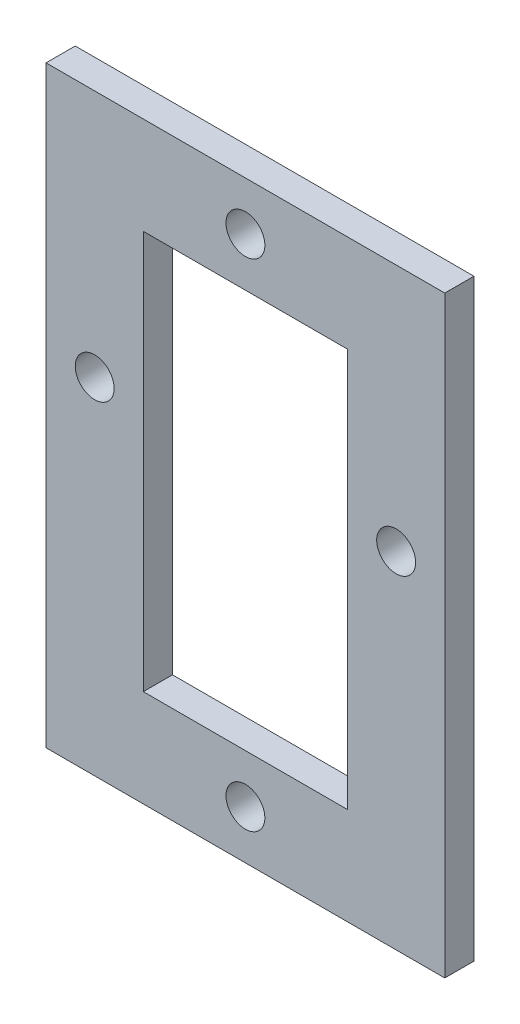
ISO-10303-21;
HEADER;
FILE_DESCRIPTION(('STEP AP214'),'2;1');
FILE_NAME('part.step','',(''),(''),'','','');
FILE_SCHEMA(('AUTOMOTIVE_DESIGN { 1 0 10303 214 1 1 1 1 }'));
ENDSEC;
DATA;
#1=APPLICATION_CONTEXT('core data for automotive mechanical design processes');
#2=APPLICATION_PROTOCOL_DEFINITION('international standard','automotive_design',2000,#1);
#3=PRODUCT_CONTEXT('',#1,'mechanical');
#4=PRODUCT('Part','Part','',(#3));
#5=PRODUCT_RELATED_PRODUCT_CATEGORY('part','',(#4));
#6=PRODUCT_DEFINITION_FORMATION('','',#4);
#7=PRODUCT_DEFINITION_CONTEXT('part definition',#1,'design');
#8=PRODUCT_DEFINITION('design','',#6,#7);
#9=PRODUCT_DEFINITION_SHAPE('','',#8);
#10=(LENGTH_UNIT() NAMED_UNIT(*) SI_UNIT(.MILLI.,.METRE.));
#11=(NAMED_UNIT(*) PLANE_ANGLE_UNIT() SI_UNIT($,.RADIAN.));
#12=(NAMED_UNIT(*) SI_UNIT($,.STERADIAN.) SOLID_ANGLE_UNIT());
#13=UNCERTAINTY_MEASURE_WITH_UNIT(LENGTH_MEASURE(1.E-05),#10,'distance_accuracy_value','');
#14=(GEOMETRIC_REPRESENTATION_CONTEXT(3) GLOBAL_UNCERTAINTY_ASSIGNED_CONTEXT((#13)) GLOBAL_UNIT_ASSIGNED_CONTEXT((#10,
#11,#12)) REPRESENTATION_CONTEXT('',''));
#15=CARTESIAN_POINT('',(0.,0.,0.));
#16=DIRECTION('',(0.,0.,1.));
#17=DIRECTION('',(1.,0.,0.));
#18=AXIS2_PLACEMENT_3D('',#15,#16,#17);
#19=CARTESIAN_POINT('',(0.,0.,3.));
#20=DIRECTION('',(1.,0.,0.));
#21=DIRECTION('',(0.,1.,0.));
#22=AXIS2_PLACEMENT_3D('',#19,#20,#21);
#23=PLANE('',#22);
#24=DIRECTION('',(0.,-1.,0.));
#25=VECTOR('',#24,1.);
#26=CARTESIAN_POINT('',(0.,0.,0.));
#27=LINE('',#26,#25);
#28=CARTESIAN_POINT('',(0.,0.,0.));
#29=VERTEX_POINT('',#28);
#30=CARTESIAN_POINT('',(0.,-61.,0.));
#31=VERTEX_POINT('',#30);
#32=EDGE_CURVE('E140',#29,#31,#27,.T.);
#33=ORIENTED_EDGE('',*,*,#32,.T.);
#34=DIRECTION('',(0.,0.,-1.));
#35=VECTOR('',#34,1.);
#36=CARTESIAN_POINT('',(0.,-61.,3.));
#37=LINE('',#36,#35);
#38=CARTESIAN_POINT('',(0.,-61.,3.));
#39=VERTEX_POINT('',#38);
#40=EDGE_CURVE('E11',#39,#31,#37,.T.);
#41=ORIENTED_EDGE('',*,*,#40,.F.);
#42=DIRECTION('',(0.,-1.,0.));
#43=VECTOR('',#42,1.);
#44=CARTESIAN_POINT('',(0.,0.,3.));
#45=LINE('',#44,#43);
#46=CARTESIAN_POINT('',(0.,0.,3.));
#47=VERTEX_POINT('',#46);
#48=EDGE_CURVE('E144',#47,#39,#45,.T.);
#49=ORIENTED_EDGE('',*,*,#48,.F.);
#50=DIRECTION('',(0.,0.,-1.));
#51=VECTOR('',#50,1.);
#52=CARTESIAN_POINT('',(0.,0.,3.));
#53=LINE('',#52,#51);
#54=EDGE_CURVE('E154',#47,#29,#53,.T.);
#55=ORIENTED_EDGE('',*,*,#54,.T.);
#56=EDGE_LOOP('',(#33,#41,#49,#55));
#57=FACE_BOUND('',#56,.T.);
#58=ADVANCED_FACE('F37',(#57),#23,.F.);
#59=CARTESIAN_POINT('',(0.,-61.,3.));
#60=DIRECTION('',(0.,1.,0.));
#61=DIRECTION('',(0.,0.,1.));
#62=AXIS2_PLACEMENT_3D('',#59,#60,#61);
#63=PLANE('',#62);
#64=DIRECTION('',(1.,0.,0.));
#65=VECTOR('',#64,1.);
#66=CARTESIAN_POINT('',(0.,-61.,0.));
#67=LINE('',#66,#65);
#68=CARTESIAN_POINT('',(41.,-61.,0.));
#69=VERTEX_POINT('',#68);
#70=EDGE_CURVE('E157',#31,#69,#67,.T.);
#71=ORIENTED_EDGE('',*,*,#70,.T.);
#72=DIRECTION('',(0.,0.,-1.));
#73=VECTOR('',#72,1.);
#74=CARTESIAN_POINT('',(41.,-61.,3.));
#75=LINE('',#74,#73);
#76=CARTESIAN_POINT('',(41.,-61.,3.));
#77=VERTEX_POINT('',#76);
#78=EDGE_CURVE('E45',#77,#69,#75,.T.);
#79=ORIENTED_EDGE('',*,*,#78,.F.);
#80=DIRECTION('',(1.,0.,0.));
#81=VECTOR('',#80,1.);
#82=CARTESIAN_POINT('',(0.,-61.,3.));
#83=LINE('',#82,#81);
#84=EDGE_CURVE('E147',#39,#77,#83,.T.);
#85=ORIENTED_EDGE('',*,*,#84,.F.);
#86=ORIENTED_EDGE('',*,*,#40,.T.);
#87=EDGE_LOOP('',(#71,#79,#85,#86));
#88=FACE_BOUND('',#87,.T.);
#89=ADVANCED_FACE('F211',(#88),#63,.F.);
#90=CARTESIAN_POINT('',(41.,0.,3.));
#91=DIRECTION('',(-1.,0.,0.));
#92=DIRECTION('',(0.,-1.,0.));
#93=AXIS2_PLACEMENT_3D('',#90,#91,#92);
#94=PLANE('',#93);
#95=DIRECTION('',(0.,1.,0.));
#96=VECTOR('',#95,1.);
#97=CARTESIAN_POINT('',(41.,0.,0.));
#98=LINE('',#97,#96);
#99=CARTESIAN_POINT('',(41.,0.,0.));
#100=VERTEX_POINT('',#99);
#101=EDGE_CURVE('E159',#69,#100,#98,.T.);
#102=ORIENTED_EDGE('',*,*,#101,.T.);
#103=DIRECTION('',(0.,0.,-1.));
#104=VECTOR('',#103,1.);
#105=CARTESIAN_POINT('',(41.,0.,3.));
#106=LINE('',#105,#104);
#107=CARTESIAN_POINT('',(41.,0.,3.));
#108=VERTEX_POINT('',#107);
#109=EDGE_CURVE('E164',#108,#100,#106,.T.);
#110=ORIENTED_EDGE('',*,*,#109,.F.);
#111=DIRECTION('',(0.,1.,0.));
#112=VECTOR('',#111,1.);
#113=CARTESIAN_POINT('',(41.,0.,3.));
#114=LINE('',#113,#112);
#115=EDGE_CURVE('E150',#77,#108,#114,.T.);
#116=ORIENTED_EDGE('',*,*,#115,.F.);
#117=ORIENTED_EDGE('',*,*,#78,.T.);
#118=EDGE_LOOP('',(#102,#110,#116,#117));
#119=FACE_BOUND('',#118,.T.);
#120=ADVANCED_FACE('F216',(#119),#94,.F.);
#121=CARTESIAN_POINT('',(0.,0.,3.));
#122=DIRECTION('',(0.,-1.,0.));
#123=DIRECTION('',(0.,0.,-1.));
#124=AXIS2_PLACEMENT_3D('',#121,#122,#123);
#125=PLANE('',#124);
#126=DIRECTION('',(-1.,0.,0.));
#127=VECTOR('',#126,1.);
#128=CARTESIAN_POINT('',(0.,0.,0.));
#129=LINE('',#128,#127);
#130=EDGE_CURVE('E148',#100,#29,#129,.T.);
#131=ORIENTED_EDGE('',*,*,#130,.T.);
#132=ORIENTED_EDGE('',*,*,#54,.F.);
#133=DIRECTION('',(-1.,0.,0.));
#134=VECTOR('',#133,1.);
#135=CARTESIAN_POINT('',(0.,0.,3.));
#136=LINE('',#135,#134);
#137=EDGE_CURVE('E152',#108,#47,#136,.T.);
#138=ORIENTED_EDGE('',*,*,#137,.F.);
#139=ORIENTED_EDGE('',*,*,#109,.T.);
#140=EDGE_LOOP('',(#131,#132,#138,#139));
#141=FACE_BOUND('',#140,.T.);
#142=ADVANCED_FACE('F198',(#141),#125,.F.);
#143=CARTESIAN_POINT('',(0.,0.,3.));
#144=DIRECTION('',(0.,0.,1.));
#145=DIRECTION('',(1.,0.,0.));
#146=AXIS2_PLACEMENT_3D('',#143,#144,#145);
#147=PLANE('',#146);
#148=CARTESIAN_POINT('',(20.5,-5.,3.));
#149=DIRECTION('',(0.,0.,1.));
#150=DIRECTION('',(1.,0.,0.));
#151=AXIS2_PLACEMENT_3D('',#148,#149,#150);
#152=CIRCLE('',#151,2.);
#153=CARTESIAN_POINT('',(22.5,-5.,3.));
#154=VERTEX_POINT('',#153);
#155=EDGE_CURVE('E170',#154,#154,#152,.T.);
#156=ORIENTED_EDGE('',*,*,#155,.F.);
#157=EDGE_LOOP('',(#156));
#158=FACE_BOUND('',#157,.T.);
#159=CARTESIAN_POINT('',(20.5,-56.,3.));
#160=DIRECTION('',(0.,0.,1.));
#161=DIRECTION('',(1.,0.,0.));
#162=AXIS2_PLACEMENT_3D('',#159,#160,#161);
#163=CIRCLE('',#162,2.00000000000001);
#164=CARTESIAN_POINT('',(22.5,-56.,3.));
#165=VERTEX_POINT('',#164);
#166=EDGE_CURVE('E175',#165,#165,#163,.T.);
#167=ORIENTED_EDGE('',*,*,#166,.F.);
#168=EDGE_LOOP('',(#167));
#169=FACE_BOUND('',#168,.T.);
#170=CARTESIAN_POINT('',(36.,-25.5,3.));
#171=DIRECTION('',(0.,0.,1.));
#172=DIRECTION('',(1.,0.,0.));
#173=AXIS2_PLACEMENT_3D('',#170,#171,#172);
#174=CIRCLE('',#173,2.);
#175=CARTESIAN_POINT('',(38.,-25.5,3.));
#176=VERTEX_POINT('',#175);
#177=EDGE_CURVE('E184',#176,#176,#174,.T.);
#178=ORIENTED_EDGE('',*,*,#177,.F.);
#179=EDGE_LOOP('',(#178));
#180=FACE_BOUND('',#179,.T.);
#181=CARTESIAN_POINT('',(5.,-25.5,3.));
#182=DIRECTION('',(0.,0.,1.));
#183=DIRECTION('',(1.,0.,0.));
#184=AXIS2_PLACEMENT_3D('',#181,#182,#183);
#185=CIRCLE('',#184,2.);
#186=CARTESIAN_POINT('',(7.,-25.5,3.));
#187=VERTEX_POINT('',#186);
#188=EDGE_CURVE('E127',#187,#187,#185,.T.);
#189=ORIENTED_EDGE('',*,*,#188,.F.);
#190=EDGE_LOOP('',(#189));
#191=FACE_BOUND('',#190,.T.);
#192=DIRECTION('',(0.,1.,0.));
#193=VECTOR('',#192,1.);
#194=CARTESIAN_POINT('',(31.,-9.99999999999999,3.));
#195=LINE('',#194,#193);
#196=CARTESIAN_POINT('',(31.,-51.,3.));
#197=VERTEX_POINT('',#196);
#198=CARTESIAN_POINT('',(31.,-9.99999999999999,3.));
#199=VERTEX_POINT('',#198);
#200=EDGE_CURVE('E53',#197,#199,#195,.T.);
#201=ORIENTED_EDGE('',*,*,#200,.F.);
#202=DIRECTION('',(1.,0.,0.));
#203=VECTOR('',#202,1.);
#204=CARTESIAN_POINT('',(10.,-51.,3.));
#205=LINE('',#204,#203);
#206=CARTESIAN_POINT('',(10.,-51.,3.));
#207=VERTEX_POINT('',#206);
#208=EDGE_CURVE('E121',#207,#197,#205,.T.);
#209=ORIENTED_EDGE('',*,*,#208,.F.);
#210=DIRECTION('',(0.,-1.,0.));
#211=VECTOR('',#210,1.);
#212=CARTESIAN_POINT('',(10.,-9.99999999999999,3.));
#213=LINE('',#212,#211);
#214=CARTESIAN_POINT('',(10.,-9.99999999999999,3.));
#215=VERTEX_POINT('',#214);
#216=EDGE_CURVE('E124',#215,#207,#213,.T.);
#217=ORIENTED_EDGE('',*,*,#216,.F.);
#218=DIRECTION('',(-1.,0.,0.));
#219=VECTOR('',#218,1.);
#220=CARTESIAN_POINT('',(10.,-9.99999999999999,3.));
#221=LINE('',#220,#219);
#222=EDGE_CURVE('E133',#199,#215,#221,.T.);
#223=ORIENTED_EDGE('',*,*,#222,.F.);
#224=EDGE_LOOP('',(#201,#209,#217,#223));
#225=FACE_BOUND('',#224,.T.);
#226=ORIENTED_EDGE('',*,*,#48,.T.);
#227=ORIENTED_EDGE('',*,*,#84,.T.);
#228=ORIENTED_EDGE('',*,*,#115,.T.);
#229=ORIENTED_EDGE('',*,*,#137,.T.);
#230=EDGE_LOOP('',(#226,#227,#228,#229));
#231=FACE_BOUND('',#230,.T.);
#232=ADVANCED_FACE('F195',(#158,#169,#180,#191,#225,#231),#147,.T.);
#233=CARTESIAN_POINT('',(0.,0.,0.));
#234=DIRECTION('',(0.,0.,1.));
#235=DIRECTION('',(1.,0.,0.));
#236=AXIS2_PLACEMENT_3D('',#233,#234,#235);
#237=PLANE('',#236);
#238=CARTESIAN_POINT('',(20.5,-5.,0.));
#239=DIRECTION('',(0.,0.,1.));
#240=DIRECTION('',(1.,0.,0.));
#241=AXIS2_PLACEMENT_3D('',#238,#239,#240);
#242=CIRCLE('',#241,2.);
#243=CARTESIAN_POINT('',(22.5,-5.,0.));
#244=VERTEX_POINT('',#243);
#245=EDGE_CURVE('E40',#244,#244,#242,.T.);
#246=ORIENTED_EDGE('',*,*,#245,.T.);
#247=EDGE_LOOP('',(#246));
#248=FACE_BOUND('',#247,.T.);
#249=CARTESIAN_POINT('',(20.5,-56.,0.));
#250=DIRECTION('',(0.,0.,1.));
#251=DIRECTION('',(1.,0.,0.));
#252=AXIS2_PLACEMENT_3D('',#249,#250,#251);
#253=CIRCLE('',#252,2.00000000000001);
#254=CARTESIAN_POINT('',(22.5,-56.,0.));
#255=VERTEX_POINT('',#254);
#256=EDGE_CURVE('E168',#255,#255,#253,.T.);
#257=ORIENTED_EDGE('',*,*,#256,.T.);
#258=EDGE_LOOP('',(#257));
#259=FACE_BOUND('',#258,.T.);
#260=CARTESIAN_POINT('',(36.,-25.5,0.));
#261=DIRECTION('',(0.,0.,1.));
#262=DIRECTION('',(1.,0.,0.));
#263=AXIS2_PLACEMENT_3D('',#260,#261,#262);
#264=CIRCLE('',#263,2.);
#265=CARTESIAN_POINT('',(38.,-25.5,0.));
#266=VERTEX_POINT('',#265);
#267=EDGE_CURVE('E134',#266,#266,#264,.T.);
#268=ORIENTED_EDGE('',*,*,#267,.T.);
#269=EDGE_LOOP('',(#268));
#270=FACE_BOUND('',#269,.T.);
#271=CARTESIAN_POINT('',(5.,-25.5,0.));
#272=DIRECTION('',(0.,0.,1.));
#273=DIRECTION('',(1.,0.,0.));
#274=AXIS2_PLACEMENT_3D('',#271,#272,#273);
#275=CIRCLE('',#274,2.);
#276=CARTESIAN_POINT('',(7.,-25.5,0.));
#277=VERTEX_POINT('',#276);
#278=EDGE_CURVE('E186',#277,#277,#275,.T.);
#279=ORIENTED_EDGE('',*,*,#278,.T.);
#280=EDGE_LOOP('',(#279));
#281=FACE_BOUND('',#280,.T.);
#282=DIRECTION('',(1.,0.,0.));
#283=VECTOR('',#282,1.);
#284=CARTESIAN_POINT('',(10.,-51.,0.));
#285=LINE('',#284,#283);
#286=CARTESIAN_POINT('',(10.,-51.,0.));
#287=VERTEX_POINT('',#286);
#288=CARTESIAN_POINT('',(31.,-51.,0.));
#289=VERTEX_POINT('',#288);
#290=EDGE_CURVE('E111',#287,#289,#285,.T.);
#291=ORIENTED_EDGE('',*,*,#290,.T.);
#292=DIRECTION('',(0.,1.,0.));
#293=VECTOR('',#292,1.);
#294=CARTESIAN_POINT('',(31.,-9.99999999999999,0.));
#295=LINE('',#294,#293);
#296=CARTESIAN_POINT('',(31.,-9.99999999999999,0.));
#297=VERTEX_POINT('',#296);
#298=EDGE_CURVE('E105',#289,#297,#295,.T.);
#299=ORIENTED_EDGE('',*,*,#298,.T.);
#300=DIRECTION('',(-1.,0.,0.));
#301=VECTOR('',#300,1.);
#302=CARTESIAN_POINT('',(10.,-9.99999999999999,0.));
#303=LINE('',#302,#301);
#304=CARTESIAN_POINT('',(10.,-9.99999999999999,0.));
#305=VERTEX_POINT('',#304);
#306=EDGE_CURVE('E114',#297,#305,#303,.T.);
#307=ORIENTED_EDGE('',*,*,#306,.T.);
#308=DIRECTION('',(0.,-1.,0.));
#309=VECTOR('',#308,1.);
#310=CARTESIAN_POINT('',(10.,-9.99999999999999,0.));
#311=LINE('',#310,#309);
#312=EDGE_CURVE('E61',#305,#287,#311,.T.);
#313=ORIENTED_EDGE('',*,*,#312,.T.);
#314=EDGE_LOOP('',(#291,#299,#307,#313));
#315=FACE_BOUND('',#314,.T.);
#316=ORIENTED_EDGE('',*,*,#32,.F.);
#317=ORIENTED_EDGE('',*,*,#130,.F.);
#318=ORIENTED_EDGE('',*,*,#101,.F.);
#319=ORIENTED_EDGE('',*,*,#70,.F.);
#320=EDGE_LOOP('',(#316,#317,#318,#319));
#321=FACE_BOUND('',#320,.T.);
#322=ADVANCED_FACE('F118',(#248,#259,#270,#281,#315,#321),#237,.F.);
#323=CARTESIAN_POINT('',(31.,-9.99999999999999,0.));
#324=DIRECTION('',(1.,0.,0.));
#325=DIRECTION('',(0.,1.,0.));
#326=AXIS2_PLACEMENT_3D('',#323,#324,#325);
#327=PLANE('',#326);
#328=ORIENTED_EDGE('',*,*,#200,.T.);
#329=DIRECTION('',(0.,0.,1.));
#330=VECTOR('',#329,1.);
#331=CARTESIAN_POINT('',(31.,-9.99999999999999,0.));
#332=LINE('',#331,#330);
#333=EDGE_CURVE('E101',#297,#199,#332,.T.);
#334=ORIENTED_EDGE('',*,*,#333,.F.);
#335=ORIENTED_EDGE('',*,*,#298,.F.);
#336=DIRECTION('',(0.,0.,1.));
#337=VECTOR('',#336,1.);
#338=CARTESIAN_POINT('',(31.,-51.,0.));
#339=LINE('',#338,#337);
#340=EDGE_CURVE('E138',#289,#197,#339,.T.);
#341=ORIENTED_EDGE('',*,*,#340,.T.);
#342=EDGE_LOOP('',(#328,#334,#335,#341));
#343=FACE_BOUND('',#342,.T.);
#344=ADVANCED_FACE('F103',(#343),#327,.F.);
#345=CARTESIAN_POINT('',(10.,-51.,0.));
#346=DIRECTION('',(0.,-1.,0.));
#347=DIRECTION('',(0.,0.,-1.));
#348=AXIS2_PLACEMENT_3D('',#345,#346,#347);
#349=PLANE('',#348);
#350=ORIENTED_EDGE('',*,*,#208,.T.);
#351=ORIENTED_EDGE('',*,*,#340,.F.);
#352=ORIENTED_EDGE('',*,*,#290,.F.);
#353=DIRECTION('',(0.,0.,1.));
#354=VECTOR('',#353,1.);
#355=CARTESIAN_POINT('',(10.,-51.,0.));
#356=LINE('',#355,#354);
#357=EDGE_CURVE('E141',#287,#207,#356,.T.);
#358=ORIENTED_EDGE('',*,*,#357,.T.);
#359=EDGE_LOOP('',(#350,#351,#352,#358));
#360=FACE_BOUND('',#359,.T.);
#361=ADVANCED_FACE('F225',(#360),#349,.F.);
#362=CARTESIAN_POINT('',(10.,-9.99999999999999,0.));
#363=DIRECTION('',(-1.,0.,0.));
#364=DIRECTION('',(0.,-1.,0.));
#365=AXIS2_PLACEMENT_3D('',#362,#363,#364);
#366=PLANE('',#365);
#367=ORIENTED_EDGE('',*,*,#216,.T.);
#368=ORIENTED_EDGE('',*,*,#357,.F.);
#369=ORIENTED_EDGE('',*,*,#312,.F.);
#370=DIRECTION('',(0.,0.,1.));
#371=VECTOR('',#370,1.);
#372=CARTESIAN_POINT('',(10.,-9.99999999999999,0.));
#373=LINE('',#372,#371);
#374=EDGE_CURVE('E110',#305,#215,#373,.T.);
#375=ORIENTED_EDGE('',*,*,#374,.T.);
#376=EDGE_LOOP('',(#367,#368,#369,#375));
#377=FACE_BOUND('',#376,.T.);
#378=ADVANCED_FACE('F289',(#377),#366,.F.);
#379=CARTESIAN_POINT('',(10.,-9.99999999999999,0.));
#380=DIRECTION('',(0.,1.,0.));
#381=DIRECTION('',(0.,0.,1.));
#382=AXIS2_PLACEMENT_3D('',#379,#380,#381);
#383=PLANE('',#382);
#384=ORIENTED_EDGE('',*,*,#222,.T.);
#385=ORIENTED_EDGE('',*,*,#374,.F.);
#386=ORIENTED_EDGE('',*,*,#306,.F.);
#387=ORIENTED_EDGE('',*,*,#333,.T.);
#388=EDGE_LOOP('',(#384,#385,#386,#387));
#389=FACE_BOUND('',#388,.T.);
#390=ADVANCED_FACE('F115',(#389),#383,.F.);
#391=CARTESIAN_POINT('',(5.,-25.5,0.));
#392=DIRECTION('',(0.,0.,1.));
#393=DIRECTION('',(1.,0.,0.));
#394=AXIS2_PLACEMENT_3D('',#391,#392,#393);
#395=CYLINDRICAL_SURFACE('',#394,2.);
#396=ORIENTED_EDGE('',*,*,#278,.F.);
#397=EDGE_LOOP('',(#396));
#398=FACE_BOUND('',#397,.T.);
#399=ORIENTED_EDGE('',*,*,#188,.T.);
#400=EDGE_LOOP('',(#399));
#401=FACE_BOUND('',#400,.T.);
#402=ADVANCED_FACE('F193',(#398,#401),#395,.F.);
#403=CARTESIAN_POINT('',(36.,-25.5,0.));
#404=DIRECTION('',(0.,0.,1.));
#405=DIRECTION('',(1.,0.,0.));
#406=AXIS2_PLACEMENT_3D('',#403,#404,#405);
#407=CYLINDRICAL_SURFACE('',#406,2.);
#408=ORIENTED_EDGE('',*,*,#267,.F.);
#409=EDGE_LOOP('',(#408));
#410=FACE_BOUND('',#409,.T.);
#411=ORIENTED_EDGE('',*,*,#177,.T.);
#412=EDGE_LOOP('',(#411));
#413=FACE_BOUND('',#412,.T.);
#414=ADVANCED_FACE('F252',(#410,#413),#407,.F.);
#415=CARTESIAN_POINT('',(20.5,-56.,-7.));
#416=DIRECTION('',(0.,0.,1.));
#417=DIRECTION('',(1.,0.,0.));
#418=AXIS2_PLACEMENT_3D('',#415,#416,#417);
#419=CYLINDRICAL_SURFACE('',#418,2.00000000000001);
#420=ORIENTED_EDGE('',*,*,#166,.T.);
#421=EDGE_LOOP('',(#420));
#422=FACE_BOUND('',#421,.T.);
#423=ORIENTED_EDGE('',*,*,#256,.F.);
#424=EDGE_LOOP('',(#423));
#425=FACE_BOUND('',#424,.T.);
#426=ADVANCED_FACE('F262',(#422,#425),#419,.F.);
#427=CARTESIAN_POINT('',(20.5,-5.,-7.));
#428=DIRECTION('',(0.,0.,1.));
#429=DIRECTION('',(1.,0.,0.));
#430=AXIS2_PLACEMENT_3D('',#427,#428,#429);
#431=CYLINDRICAL_SURFACE('',#430,2.);
#432=ORIENTED_EDGE('',*,*,#155,.T.);
#433=EDGE_LOOP('',(#432));
#434=FACE_BOUND('',#433,.T.);
#435=ORIENTED_EDGE('',*,*,#245,.F.);
#436=EDGE_LOOP('',(#435));
#437=FACE_BOUND('',#436,.T.);
#438=ADVANCED_FACE('F267',(#434,#437),#431,.F.);
#439=CLOSED_SHELL('',(#58,#89,#120,#142,#232,#322,#344,#361,#378,#390,#402,#414,#426,#438));
#440=MANIFOLD_SOLID_BREP('B2',#439);
#441=ADVANCED_BREP_SHAPE_REPRESENTATION('',(#18,#440),#14);
#442=SHAPE_DEFINITION_REPRESENTATION(#9,#441);
ENDSEC;
END-ISO-10303-21;
